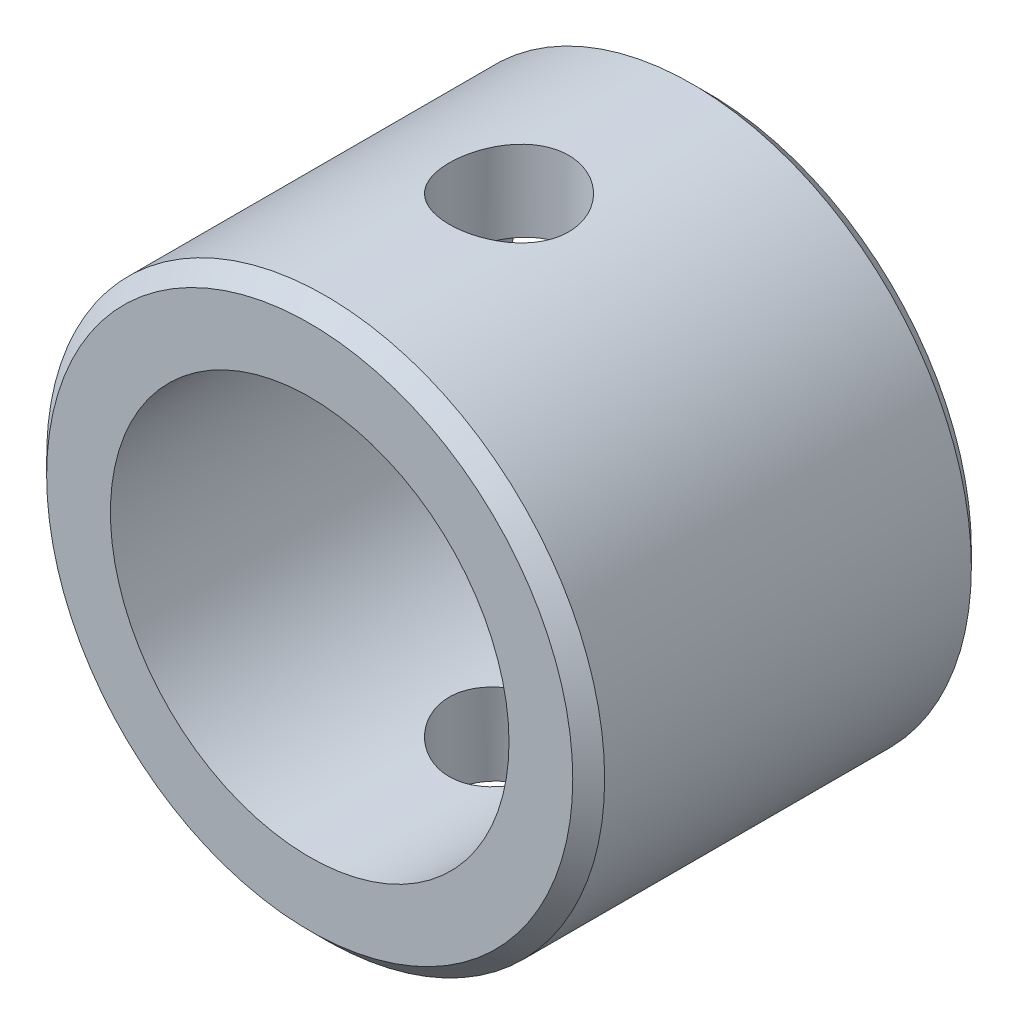
ISO-10303-21;
HEADER;
FILE_DESCRIPTION(('STEP AP214'),'2;1');
FILE_NAME('part.step','',(''),(''),'','','');
FILE_SCHEMA(('AUTOMOTIVE_DESIGN { 1 0 10303 214 1 1 1 1 }'));
ENDSEC;
DATA;
#1=APPLICATION_CONTEXT('core data for automotive mechanical design processes');
#2=APPLICATION_PROTOCOL_DEFINITION('international standard','automotive_design',2000,#1);
#3=PRODUCT_CONTEXT('',#1,'mechanical');
#4=PRODUCT('Part','Part','',(#3));
#5=PRODUCT_RELATED_PRODUCT_CATEGORY('part','',(#4));
#6=PRODUCT_DEFINITION_FORMATION('','',#4);
#7=PRODUCT_DEFINITION_CONTEXT('part definition',#1,'design');
#8=PRODUCT_DEFINITION('design','',#6,#7);
#9=PRODUCT_DEFINITION_SHAPE('','',#8);
#10=(LENGTH_UNIT() NAMED_UNIT(*) SI_UNIT(.MILLI.,.METRE.));
#11=(NAMED_UNIT(*) PLANE_ANGLE_UNIT() SI_UNIT($,.RADIAN.));
#12=(NAMED_UNIT(*) SI_UNIT($,.STERADIAN.) SOLID_ANGLE_UNIT());
#13=UNCERTAINTY_MEASURE_WITH_UNIT(LENGTH_MEASURE(1.E-05),#10,'distance_accuracy_value','');
#14=(GEOMETRIC_REPRESENTATION_CONTEXT(3) GLOBAL_UNCERTAINTY_ASSIGNED_CONTEXT((#13)) GLOBAL_UNIT_ASSIGNED_CONTEXT((#10,
#11,#12)) REPRESENTATION_CONTEXT('',''));
#15=CARTESIAN_POINT('',(0.,0.,0.));
#16=DIRECTION('',(0.,0.,1.));
#17=DIRECTION('',(1.,0.,0.));
#18=AXIS2_PLACEMENT_3D('',#15,#16,#17);
#19=CARTESIAN_POINT('',(0.,0.,2.5));
#20=DIRECTION('',(0.,0.,1.));
#21=DIRECTION('',(1.,0.,0.));
#22=AXIS2_PLACEMENT_3D('',#19,#20,#21);
#23=PLANE('',#22);
#24=CARTESIAN_POINT('',(0.,0.,2.5));
#25=DIRECTION('',(0.,0.,1.));
#26=DIRECTION('',(1.,0.,0.));
#27=AXIS2_PLACEMENT_3D('',#24,#25,#26);
#28=CIRCLE('',#27,3.3);
#29=CARTESIAN_POINT('',(3.3,0.,2.5));
#30=VERTEX_POINT('',#29);
#31=EDGE_CURVE('E10',#30,#30,#28,.T.);
#32=ORIENTED_EDGE('',*,*,#31,.T.);
#33=EDGE_LOOP('',(#32));
#34=FACE_BOUND('',#33,.T.);
#35=CARTESIAN_POINT('',(0.,0.,2.5));
#36=DIRECTION('',(0.,0.,1.));
#37=DIRECTION('',(1.,0.,0.));
#38=AXIS2_PLACEMENT_3D('',#35,#36,#37);
#39=CIRCLE('',#38,2.5);
#40=CARTESIAN_POINT('',(2.5,0.,2.5));
#41=VERTEX_POINT('',#40);
#42=EDGE_CURVE('E85',#41,#41,#39,.T.);
#43=ORIENTED_EDGE('',*,*,#42,.F.);
#44=EDGE_LOOP('',(#43));
#45=FACE_BOUND('',#44,.T.);
#46=ADVANCED_FACE('F32',(#34,#45),#23,.T.);
#47=CARTESIAN_POINT('',(0.,0.,-2.5));
#48=DIRECTION('',(0.,0.,1.));
#49=DIRECTION('',(1.,0.,0.));
#50=AXIS2_PLACEMENT_3D('',#47,#48,#49);
#51=PLANE('',#50);
#52=CARTESIAN_POINT('',(0.,0.,-2.5));
#53=DIRECTION('',(0.,0.,1.));
#54=DIRECTION('',(1.,0.,0.));
#55=AXIS2_PLACEMENT_3D('',#52,#53,#54);
#56=CIRCLE('',#55,3.3);
#57=CARTESIAN_POINT('',(3.3,0.,-2.5));
#58=VERTEX_POINT('',#57);
#59=EDGE_CURVE('E45',#58,#58,#56,.F.);
#60=ORIENTED_EDGE('',*,*,#59,.T.);
#61=EDGE_LOOP('',(#60));
#62=FACE_BOUND('',#61,.T.);
#63=CARTESIAN_POINT('',(0.,0.,-2.5));
#64=DIRECTION('',(0.,0.,1.));
#65=DIRECTION('',(1.,0.,0.));
#66=AXIS2_PLACEMENT_3D('',#63,#64,#65);
#67=CIRCLE('',#66,2.5);
#68=CARTESIAN_POINT('',(2.5,0.,-2.5));
#69=VERTEX_POINT('',#68);
#70=EDGE_CURVE('E82',#69,#69,#67,.T.);
#71=ORIENTED_EDGE('',*,*,#70,.T.);
#72=EDGE_LOOP('',(#71));
#73=FACE_BOUND('',#72,.T.);
#74=ADVANCED_FACE('F106',(#62,#73),#51,.F.);
#75=CARTESIAN_POINT('',(0.,0.,2.5));
#76=DIRECTION('',(0.,0.,-1.));
#77=DIRECTION('',(-1.,0.,0.));
#78=AXIS2_PLACEMENT_3D('',#75,#76,#77);
#79=CYLINDRICAL_SURFACE('',#78,3.5);
#80=CARTESIAN_POINT('',(0.,-3.5,0.75));
#81=CARTESIAN_POINT('',(0.0416179430453083,-3.49999923021613,0.749998550212849));
#82=CARTESIAN_POINT('',(0.0832535978001373,-3.49925012974855,0.746524195806072));
#83=CARTESIAN_POINT('',(0.165343672146664,-3.49633414913864,0.732732171573204));
#84=CARTESIAN_POINT('',(0.205797201785595,-3.4941662281855,0.722409477902533));
#85=CARTESIAN_POINT('',(0.284324661908868,-3.48865415894413,0.695257817695982));
#86=CARTESIAN_POINT('',(0.322400981723278,-3.48531121483585,0.678435510309341));
#87=CARTESIAN_POINT('',(0.395189088980394,-3.47781053408985,0.638782956914368));
#88=CARTESIAN_POINT('',(0.429900990873685,-3.4736528251833,0.615952915375029));
#89=CARTESIAN_POINT('',(0.495512395267615,-3.46490684623155,0.564559850163246));
#90=CARTESIAN_POINT('',(0.526352517097226,-3.4603134157163,0.535921889050737));
#91=CARTESIAN_POINT('',(0.582830211947175,-3.45125034907072,0.473886842157402));
#92=CARTESIAN_POINT('',(0.608467335754541,-3.44678072365815,0.440489345874371));
#93=CARTESIAN_POINT('',(0.654071021899043,-3.43842058023612,0.369447123569784));
#94=CARTESIAN_POINT('',(0.673974791675044,-3.4345366817218,0.331761241121895));
#95=CARTESIAN_POINT('',(0.707144118455738,-3.42786162779268,0.253482773116581));
#96=CARTESIAN_POINT('',(0.720410435008579,-3.42507034735355,0.212890520753713));
#97=CARTESIAN_POINT('',(0.739732872112272,-3.42094904463155,0.130594456705963));
#98=CARTESIAN_POINT('',(0.745893898741712,-3.41959778448243,0.0889163621680674));
#99=CARTESIAN_POINT('',(0.751156976032885,-3.41844569922553,0.00509788374650247));
#100=CARTESIAN_POINT('',(0.750259858323147,-3.41864469145864,-0.0370424450899735));
#101=CARTESIAN_POINT('',(0.741516631704307,-3.42055138301916,-0.119812343966896));
#102=CARTESIAN_POINT('',(0.733791993247041,-3.42223270841081,-0.160455444550077));
#103=CARTESIAN_POINT('',(0.711805271493384,-3.42687296687894,-0.239855120144671));
#104=CARTESIAN_POINT('',(0.697542834682328,-3.42983196904201,-0.27861159301616));
#105=CARTESIAN_POINT('',(0.662772755379956,-3.43672040377862,-0.353481436436669));
#106=CARTESIAN_POINT('',(0.642218054864149,-3.44065710491682,-0.389572256356276));
#107=CARTESIAN_POINT('',(0.595480036419966,-3.44905286250644,-0.457837582478979));
#108=CARTESIAN_POINT('',(0.56929598051781,-3.45351198740948,-0.490011574343101));
#109=CARTESIAN_POINT('',(0.511397713776601,-3.46256359196939,-0.550229677836699));
#110=CARTESIAN_POINT('',(0.479580116982205,-3.46715691986089,-0.578174353292369));
#111=CARTESIAN_POINT('',(0.411658653134548,-3.4758750874853,-0.62834686684483));
#112=CARTESIAN_POINT('',(0.3755547143877,-3.47999991937986,-0.650574609300195));
#113=CARTESIAN_POINT('',(0.29996673102498,-3.48732889267001,-0.688705339953465));
#114=CARTESIAN_POINT('',(0.260476129431741,-3.49053119321677,-0.704595706288991));
#115=CARTESIAN_POINT('',(0.179301573342853,-3.49564054622667,-0.729487824160543));
#116=CARTESIAN_POINT('',(0.137617925566835,-3.49754777930192,-0.738490536281658));
#117=CARTESIAN_POINT('',(0.0540938354183148,-3.49982653173904,-0.749208107071712));
#118=CARTESIAN_POINT('',(0.0122715886358077,-3.50022668260533,-0.75105885644089));
#119=CARTESIAN_POINT('',(-0.071084486825202,-3.49952624467985,-0.747787714437418));
#120=CARTESIAN_POINT('',(-0.112618334063627,-3.49842575337849,-0.74266627601853));
#121=CARTESIAN_POINT('',(-0.193771268991403,-3.49486571522633,-0.725708878169149));
#122=CARTESIAN_POINT('',(-0.233405856454239,-3.4924205252273,-0.713943815263733));
#123=CARTESIAN_POINT('',(-0.310139225236709,-3.48644462210755,-0.68411152850259));
#124=CARTESIAN_POINT('',(-0.34723779629387,-3.48291381911119,-0.666043782844173));
#125=CARTESIAN_POINT('',(-0.418410698982377,-3.475087521952,-0.623833228469837));
#126=CARTESIAN_POINT('',(-0.45243628755557,-3.47078215677137,-0.599610102545136));
#127=CARTESIAN_POINT('',(-0.515988462761798,-3.46190516517423,-0.545882587555632));
#128=CARTESIAN_POINT('',(-0.545514489345998,-3.45733350571049,-0.516377542056279));
#129=CARTESIAN_POINT('',(-0.599763555289945,-3.44834086353162,-0.452301314906432));
#130=CARTESIAN_POINT('',(-0.624392686275782,-3.44392396110642,-0.417649950388949));
#131=CARTESIAN_POINT('',(-0.667482076930202,-3.4358332727984,-0.344622701761004));
#132=CARTESIAN_POINT('',(-0.685942599568528,-3.43215945524027,-0.306246976511254));
#133=CARTESIAN_POINT('',(-0.716048706242739,-3.42600504903695,-0.227063850502699));
#134=CARTESIAN_POINT('',(-0.727731993206375,-3.42351787291483,-0.186271321784666));
#135=CARTESIAN_POINT('',(-0.744063480426676,-3.42000593354209,-0.103242208083182));
#136=CARTESIAN_POINT('',(-0.748712753901288,-3.41898094719853,-0.0610058443993403));
#137=CARTESIAN_POINT('',(-0.750799999630202,-3.41852309424078,0.0227661715876213));
#138=CARTESIAN_POINT('',(-0.748386736291556,-3.41905738259271,0.0642980074902891));
#139=CARTESIAN_POINT('',(-0.736748947031653,-3.42158381592415,0.146348621066293));
#140=CARTESIAN_POINT('',(-0.727524494789895,-3.42357594513357,0.186867409693287));
#141=CARTESIAN_POINT('',(-0.702596729702168,-3.42877790552079,0.265629328934584));
#142=CARTESIAN_POINT('',(-0.686914235854434,-3.43198382112351,0.303879324332146));
#143=CARTESIAN_POINT('',(-0.649533757978003,-3.43925382295324,0.377227686253425));
#144=CARTESIAN_POINT('',(-0.627835176507498,-3.44331799440181,0.412325739307522));
#145=CARTESIAN_POINT('',(-0.578541451746518,-3.45194527796616,0.479109096862683));
#146=CARTESIAN_POINT('',(-0.550839937106183,-3.45651654969463,0.510714847973489));
#147=CARTESIAN_POINT('',(-0.49054327730981,-3.46558724899847,0.56887813126023));
#148=CARTESIAN_POINT('',(-0.457947004692798,-3.47008665975648,0.595434497156103));
#149=CARTESIAN_POINT('',(-0.388301573634359,-3.47857245524493,0.643057979752781));
#150=CARTESIAN_POINT('',(-0.351202423004821,-3.48255182285313,0.664053303115489));
#151=CARTESIAN_POINT('',(-0.273925080470299,-3.48947913052009,0.699477264453091));
#152=CARTESIAN_POINT('',(-0.23374955293194,-3.49242795106171,0.713911511292518));
#153=CARTESIAN_POINT('',(-0.161267608776602,-3.49642424230886,0.733176092565575));
#154=CARTESIAN_POINT('',(-0.129358602772989,-3.49775695944132,0.739473216990016));
#155=CARTESIAN_POINT('',(-0.0649699804269229,-3.4995451207736,0.747885650855834));
#156=CARTESIAN_POINT('',(-0.0324903875443724,-3.50000060095657,0.75000113182303));
#157=CARTESIAN_POINT('',(0.,-3.5,0.75));
#158=B_SPLINE_CURVE_WITH_KNOTS('',3,(#80,#81,#82,#83,#84,#85,#86,#87,#88,#89,#90,#91,#92,#93,
#94,#95,#96,#97,#98,#99,#100,#101,#102,#103,#104,#105,#106,#107,#108,#109,#110,#111,#112,#113,
#114,#115,#116,#117,#118,#119,#120,#121,#122,#123,#124,#125,#126,#127,#128,#129,#130,#131,#132,
#133,#134,#135,#136,#137,#138,#139,#140,#141,#142,#143,#144,#145,#146,#147,#148,#149,#150,#151,
#152,#153,#154,#155,#156,#157),.UNSPECIFIED.,.T.,.F.,(4,2,2,2,2,2,2,2,2,2,2,2,2,2,2,2,2,2,2,2,2,
2,2,2,2,2,2,2,2,2,2,2,2,2,2,2,2,2,4),(0.,0.124734918256041,0.249561441609968,0.374260412212801,
0.498955139322943,0.62537480940866,0.751805389592532,0.879572146072552,1.00732427838745,
1.13316504062333,1.25899097584582,1.38262237726464,1.50626046452284,1.63084678082984,
1.75544943960445,1.88263505525145,2.00982279851175,2.13726260569903,2.26468463628172,
2.38967332852092,2.51465390115715,2.63832530294634,2.76200694599217,2.88739366933901,
3.01279598652242,3.14041031641767,3.26801920537903,3.39491120204237,3.52178383614593,
3.64600340270147,3.77022162554135,3.89404249853393,4.01787567225812,4.14411475077057,
4.27038295198557,4.39820955178611,4.52592667005135,4.62330899566147,4.72068732668668),.UNSPECIFIED.);
#159=CARTESIAN_POINT('',(0.,-3.5,0.75));
#160=VERTEX_POINT('',#159);
#161=EDGE_CURVE('E77',#160,#160,#158,.T.);
#162=ORIENTED_EDGE('',*,*,#161,.T.);
#163=EDGE_LOOP('',(#162));
#164=FACE_BOUND('',#163,.T.);
#165=CARTESIAN_POINT('',(0.,3.5,0.75));
#166=CARTESIAN_POINT('',(-0.0416179430453083,3.49999923021613,0.749998550212849));
#167=CARTESIAN_POINT('',(-0.0832535978001373,3.49925012974855,0.746524195806072));
#168=CARTESIAN_POINT('',(-0.165343672146664,3.49633414913864,0.732732171573204));
#169=CARTESIAN_POINT('',(-0.205797201785595,3.4941662281855,0.722409477902533));
#170=CARTESIAN_POINT('',(-0.284324661908868,3.48865415894413,0.695257817695982));
#171=CARTESIAN_POINT('',(-0.322400981723278,3.48531121483585,0.678435510309341));
#172=CARTESIAN_POINT('',(-0.395189088980394,3.47781053408985,0.638782956914368));
#173=CARTESIAN_POINT('',(-0.429900990873685,3.4736528251833,0.615952915375029));
#174=CARTESIAN_POINT('',(-0.495512395267615,3.46490684623155,0.564559850163246));
#175=CARTESIAN_POINT('',(-0.526352517097226,3.4603134157163,0.535921889050737));
#176=CARTESIAN_POINT('',(-0.582830211947175,3.45125034907072,0.473886842157402));
#177=CARTESIAN_POINT('',(-0.608467335754541,3.44678072365815,0.440489345874371));
#178=CARTESIAN_POINT('',(-0.654071021899043,3.43842058023612,0.369447123569784));
#179=CARTESIAN_POINT('',(-0.673974791675044,3.4345366817218,0.331761241121895));
#180=CARTESIAN_POINT('',(-0.707144118455738,3.42786162779268,0.253482773116581));
#181=CARTESIAN_POINT('',(-0.720410435008579,3.42507034735355,0.212890520753713));
#182=CARTESIAN_POINT('',(-0.739732872112272,3.42094904463155,0.130594456705963));
#183=CARTESIAN_POINT('',(-0.745893898741712,3.41959778448243,0.0889163621680674));
#184=CARTESIAN_POINT('',(-0.751156976032885,3.41844569922553,0.00509788374650247));
#185=CARTESIAN_POINT('',(-0.750259858323147,3.41864469145864,-0.0370424450899735));
#186=CARTESIAN_POINT('',(-0.741516631704307,3.42055138301916,-0.119812343966896));
#187=CARTESIAN_POINT('',(-0.733791993247041,3.42223270841081,-0.160455444550077));
#188=CARTESIAN_POINT('',(-0.711805271493384,3.42687296687894,-0.239855120144671));
#189=CARTESIAN_POINT('',(-0.697542834682328,3.42983196904201,-0.27861159301616));
#190=CARTESIAN_POINT('',(-0.662772755379956,3.43672040377862,-0.353481436436669));
#191=CARTESIAN_POINT('',(-0.642218054864149,3.44065710491682,-0.389572256356276));
#192=CARTESIAN_POINT('',(-0.595480036419966,3.44905286250644,-0.457837582478979));
#193=CARTESIAN_POINT('',(-0.56929598051781,3.45351198740948,-0.490011574343101));
#194=CARTESIAN_POINT('',(-0.511397713776601,3.46256359196939,-0.550229677836699));
#195=CARTESIAN_POINT('',(-0.479580116982205,3.46715691986089,-0.578174353292369));
#196=CARTESIAN_POINT('',(-0.411658653134548,3.4758750874853,-0.62834686684483));
#197=CARTESIAN_POINT('',(-0.3755547143877,3.47999991937986,-0.650574609300195));
#198=CARTESIAN_POINT('',(-0.29996673102498,3.48732889267001,-0.688705339953465));
#199=CARTESIAN_POINT('',(-0.260476129431741,3.49053119321677,-0.704595706288991));
#200=CARTESIAN_POINT('',(-0.179301573342853,3.49564054622667,-0.729487824160543));
#201=CARTESIAN_POINT('',(-0.137617925566835,3.49754777930192,-0.738490536281658));
#202=CARTESIAN_POINT('',(-0.0540938354183148,3.49982653173904,-0.749208107071712));
#203=CARTESIAN_POINT('',(-0.0122715886358077,3.50022668260533,-0.75105885644089));
#204=CARTESIAN_POINT('',(0.071084486825202,3.49952624467985,-0.747787714437418));
#205=CARTESIAN_POINT('',(0.112618334063627,3.49842575337849,-0.74266627601853));
#206=CARTESIAN_POINT('',(0.193771268991403,3.49486571522633,-0.725708878169149));
#207=CARTESIAN_POINT('',(0.233405856454239,3.4924205252273,-0.713943815263733));
#208=CARTESIAN_POINT('',(0.310139225236709,3.48644462210755,-0.68411152850259));
#209=CARTESIAN_POINT('',(0.34723779629387,3.48291381911119,-0.666043782844173));
#210=CARTESIAN_POINT('',(0.418410698982377,3.475087521952,-0.623833228469837));
#211=CARTESIAN_POINT('',(0.45243628755557,3.47078215677137,-0.599610102545136));
#212=CARTESIAN_POINT('',(0.515988462761798,3.46190516517423,-0.545882587555632));
#213=CARTESIAN_POINT('',(0.545514489345998,3.45733350571049,-0.516377542056279));
#214=CARTESIAN_POINT('',(0.599763555289945,3.44834086353162,-0.452301314906432));
#215=CARTESIAN_POINT('',(0.624392686275782,3.44392396110642,-0.417649950388949));
#216=CARTESIAN_POINT('',(0.667482076930202,3.4358332727984,-0.344622701761004));
#217=CARTESIAN_POINT('',(0.685942599568528,3.43215945524027,-0.306246976511254));
#218=CARTESIAN_POINT('',(0.716048706242739,3.42600504903695,-0.227063850502699));
#219=CARTESIAN_POINT('',(0.727731993206375,3.42351787291483,-0.186271321784666));
#220=CARTESIAN_POINT('',(0.744063480426676,3.42000593354209,-0.103242208083182));
#221=CARTESIAN_POINT('',(0.748712753901288,3.41898094719853,-0.0610058443993403));
#222=CARTESIAN_POINT('',(0.750799999630202,3.41852309424078,0.0227661715876213));
#223=CARTESIAN_POINT('',(0.748386736291556,3.41905738259271,0.0642980074902891));
#224=CARTESIAN_POINT('',(0.736748947031653,3.42158381592415,0.146348621066293));
#225=CARTESIAN_POINT('',(0.727524494789895,3.42357594513357,0.186867409693287));
#226=CARTESIAN_POINT('',(0.702596729702168,3.42877790552079,0.265629328934584));
#227=CARTESIAN_POINT('',(0.686914235854434,3.43198382112351,0.303879324332146));
#228=CARTESIAN_POINT('',(0.649533757978003,3.43925382295324,0.377227686253425));
#229=CARTESIAN_POINT('',(0.627835176507498,3.44331799440181,0.412325739307522));
#230=CARTESIAN_POINT('',(0.578541451746518,3.45194527796616,0.479109096862683));
#231=CARTESIAN_POINT('',(0.550839937106183,3.45651654969463,0.510714847973489));
#232=CARTESIAN_POINT('',(0.49054327730981,3.46558724899847,0.56887813126023));
#233=CARTESIAN_POINT('',(0.457947004692798,3.47008665975648,0.595434497156103));
#234=CARTESIAN_POINT('',(0.388301573634359,3.47857245524493,0.643057979752781));
#235=CARTESIAN_POINT('',(0.351202423004821,3.48255182285313,0.664053303115489));
#236=CARTESIAN_POINT('',(0.273925080470299,3.48947913052009,0.699477264453091));
#237=CARTESIAN_POINT('',(0.23374955293194,3.49242795106171,0.713911511292518));
#238=CARTESIAN_POINT('',(0.161267608776602,3.49642424230886,0.733176092565575));
#239=CARTESIAN_POINT('',(0.129358602772989,3.49775695944132,0.739473216990016));
#240=CARTESIAN_POINT('',(0.0649699804269229,3.4995451207736,0.747885650855834));
#241=CARTESIAN_POINT('',(0.0324903875443724,3.50000060095657,0.75000113182303));
#242=CARTESIAN_POINT('',(0.,3.5,0.75));
#243=B_SPLINE_CURVE_WITH_KNOTS('',3,(#165,#166,#167,#168,#169,#170,#171,#172,#173,#174,#175,
#176,#177,#178,#179,#180,#181,#182,#183,#184,#185,#186,#187,#188,#189,#190,#191,#192,#193,#194,
#195,#196,#197,#198,#199,#200,#201,#202,#203,#204,#205,#206,#207,#208,#209,#210,#211,#212,#213,
#214,#215,#216,#217,#218,#219,#220,#221,#222,#223,#224,#225,#226,#227,#228,#229,#230,#231,#232,
#233,#234,#235,#236,#237,#238,#239,#240,#241,#242),.UNSPECIFIED.,.T.,.F.,(4,2,2,2,2,2,2,2,2,2,2,
2,2,2,2,2,2,2,2,2,2,2,2,2,2,2,2,2,2,2,2,2,2,2,2,2,2,2,4),(0.,0.124734918256041,
0.249561441609968,0.374260412212801,0.498955139322943,0.62537480940866,0.751805389592532,
0.879572146072552,1.00732427838745,1.13316504062333,1.25899097584582,1.38262237726464,
1.50626046452284,1.63084678082984,1.75544943960445,1.88263505525145,2.00982279851175,
2.13726260569903,2.26468463628172,2.38967332852092,2.51465390115715,2.63832530294634,
2.76200694599217,2.88739366933901,3.01279598652242,3.14041031641767,3.26801920537903,
3.39491120204237,3.52178383614593,3.64600340270147,3.77022162554135,3.89404249853393,
4.01787567225812,4.14411475077057,4.27038295198557,4.39820955178611,4.52592667005135,
4.62330899566147,4.72068732668668),.UNSPECIFIED.);
#244=CARTESIAN_POINT('',(0.,3.5,0.75));
#245=VERTEX_POINT('',#244);
#246=EDGE_CURVE('E73',#245,#245,#243,.T.);
#247=ORIENTED_EDGE('',*,*,#246,.T.);
#248=EDGE_LOOP('',(#247));
#249=FACE_BOUND('',#248,.T.);
#250=CARTESIAN_POINT('',(0.,0.,-2.3));
#251=DIRECTION('',(0.,0.,1.));
#252=DIRECTION('',(1.,0.,0.));
#253=AXIS2_PLACEMENT_3D('',#250,#251,#252);
#254=CIRCLE('',#253,3.5);
#255=CARTESIAN_POINT('',(3.5,0.,-2.3));
#256=VERTEX_POINT('',#255);
#257=EDGE_CURVE('E50',#256,#256,#254,.T.);
#258=ORIENTED_EDGE('',*,*,#257,.T.);
#259=EDGE_LOOP('',(#258));
#260=FACE_BOUND('',#259,.T.);
#261=CARTESIAN_POINT('',(0.,0.,2.3));
#262=DIRECTION('',(0.,0.,1.));
#263=DIRECTION('',(1.,0.,0.));
#264=AXIS2_PLACEMENT_3D('',#261,#262,#263);
#265=CIRCLE('',#264,3.5);
#266=CARTESIAN_POINT('',(3.5,0.,2.3));
#267=VERTEX_POINT('',#266);
#268=EDGE_CURVE('E88',#267,#267,#265,.F.);
#269=ORIENTED_EDGE('',*,*,#268,.T.);
#270=EDGE_LOOP('',(#269));
#271=FACE_BOUND('',#270,.T.);
#272=ADVANCED_FACE('F34',(#164,#249,#260,#271),#79,.T.);
#273=CARTESIAN_POINT('',(0.,0.,2.5));
#274=DIRECTION('',(0.,0.,-1.));
#275=DIRECTION('',(-1.,0.,0.));
#276=AXIS2_PLACEMENT_3D('',#273,#274,#275);
#277=CYLINDRICAL_SURFACE('',#276,2.5);
#278=CARTESIAN_POINT('',(0.,-2.5,0.75));
#279=CARTESIAN_POINT('',(0.04114430637665,-2.49999964625275,0.749999501257557));
#280=CARTESIAN_POINT('',(0.0822936591757648,-2.49897457846979,0.746603068188016));
#281=CARTESIAN_POINT('',(0.16339406265244,-2.49498552796844,0.73313932288895));
#282=CARTESIAN_POINT('',(0.20334475220571,-2.49202096694839,0.723070020988332));
#283=CARTESIAN_POINT('',(0.280866353877264,-2.48447776250925,0.696626991544865));
#284=CARTESIAN_POINT('',(0.318440682197688,-2.47990150125239,0.680262565190522));
#285=CARTESIAN_POINT('',(0.390312090526564,-2.46961054618796,0.641731953472092));
#286=CARTESIAN_POINT('',(0.42460873373483,-2.46389570095935,0.619564996302328));
#287=CARTESIAN_POINT('',(0.489935898591878,-2.45175368596488,0.569387996263628));
#288=CARTESIAN_POINT('',(0.52085903562219,-2.445311918289,0.541241687056902));
#289=CARTESIAN_POINT('',(0.577624604616599,-2.43252917104839,0.480195385045049));
#290=CARTESIAN_POINT('',(0.603466181637131,-2.42618820860824,0.447294593938046));
#291=CARTESIAN_POINT('',(0.649900188618613,-2.41417056998345,0.376764623480656));
#292=CARTESIAN_POINT('',(0.67036154511135,-2.4085120333744,0.339045769502603));
#293=CARTESIAN_POINT('',(0.704606973873519,-2.39871810191514,0.260505372886881));
#294=CARTESIAN_POINT('',(0.71839264959881,-2.39458234136111,0.219684578043583));
#295=CARTESIAN_POINT('',(0.738508168412816,-2.38845435439231,0.13730486693343));
#296=CARTESIAN_POINT('',(0.745035981175235,-2.38640534735888,0.0957986280532265));
#297=CARTESIAN_POINT('',(0.751068653075396,-2.38451394948142,0.0122334218736274));
#298=CARTESIAN_POINT('',(0.750575213805359,-2.38467102399598,-0.0298254090372626));
#299=CARTESIAN_POINT('',(0.742734885998503,-2.38712372015292,-0.111691954302934));
#300=CARTESIAN_POINT('',(0.735636026313277,-2.38934194294585,-0.151526125180769));
#301=CARTESIAN_POINT('',(0.715187102135428,-2.39554178119298,-0.229409893137081));
#302=CARTESIAN_POINT('',(0.701836420708244,-2.3995235706752,-0.267459313687261));
#303=CARTESIAN_POINT('',(0.669080133268367,-2.40886366536123,-0.341300174830274));
#304=CARTESIAN_POINT('',(0.649594084673201,-2.4142400805761,-0.377053541977606));
#305=CARTESIAN_POINT('',(0.605176112943427,-2.42575493500398,-0.444866011005122));
#306=CARTESIAN_POINT('',(0.580242870012944,-2.43189355873595,-0.476924214706896));
#307=CARTESIAN_POINT('',(0.524406453827728,-2.44455505648865,-0.537843095381003));
#308=CARTESIAN_POINT('',(0.493297453733485,-2.45108327155221,-0.566514332014834));
#309=CARTESIAN_POINT('',(0.426631629656984,-2.46356122031657,-0.618276992032127));
#310=CARTESIAN_POINT('',(0.391074525930444,-2.46951091759212,-0.641368064207214));
#311=CARTESIAN_POINT('',(0.316177519171401,-2.48021580034728,-0.681429961232365));
#312=CARTESIAN_POINT('',(0.276813874873975,-2.48496271834155,-0.698358758124931));
#313=CARTESIAN_POINT('',(0.195622707801759,-2.49266760916113,-0.725299795049816));
#314=CARTESIAN_POINT('',(0.153795875794791,-2.495626080935,-0.735313964266245));
#315=CARTESIAN_POINT('',(0.0704761213341654,-2.49934182321769,-0.747826088949697));
#316=CARTESIAN_POINT('',(0.0290250488005928,-2.50017425208896,-0.750580792900804));
#317=CARTESIAN_POINT('',(-0.0537498029116913,-2.49976461620878,-0.749215422143961));
#318=CARTESIAN_POINT('',(-0.0950735983453891,-2.49852282838873,-0.745096265174283));
#319=CARTESIAN_POINT('',(-0.17545180265485,-2.49415348493587,-0.730307694444248));
#320=CARTESIAN_POINT('',(-0.21453638630709,-2.49106914899727,-0.719788306209551));
#321=CARTESIAN_POINT('',(-0.290377319477256,-2.48337173920747,-0.692678383610914));
#322=CARTESIAN_POINT('',(-0.327133388512772,-2.47875848160472,-0.676087119481123));
#323=CARTESIAN_POINT('',(-0.398218594730547,-2.46834827175735,-0.636873417259379));
#324=CARTESIAN_POINT('',(-0.432471913099914,-2.4625264041511,-0.614120329525805));
#325=CARTESIAN_POINT('',(-0.496761653989995,-2.45036734381886,-0.563387622973804));
#326=CARTESIAN_POINT('',(-0.526797016177672,-2.44403002214522,-0.535406694056946));
#327=CARTESIAN_POINT('',(-0.582928722755441,-2.43126585935624,-0.473806345814516));
#328=CARTESIAN_POINT('',(-0.608842406158679,-2.42484412520639,-0.440019062111055));
#329=CARTESIAN_POINT('',(-0.654644975359607,-2.41288257615227,-0.36843603049631));
#330=CARTESIAN_POINT('',(-0.674534019143021,-2.40734273812361,-0.330640387732386));
#331=CARTESIAN_POINT('',(-0.707586735638617,-2.39783594822466,-0.252233754364879));
#332=CARTESIAN_POINT('',(-0.720781734698862,-2.39386168977456,-0.211636906696705));
#333=CARTESIAN_POINT('',(-0.740108654089556,-2.38795797236724,-0.128656015497233));
#334=CARTESIAN_POINT('',(-0.746242994897492,-2.38602781268684,-0.0862725895943309));
#335=CARTESIAN_POINT('',(-0.751109922422095,-2.38449986234108,-0.00281924081899464));
#336=CARTESIAN_POINT('',(-0.750140276541593,-2.38480823717645,0.0382318255068891));
#337=CARTESIAN_POINT('',(-0.741537527224924,-2.38749700647879,0.119557051688304));
#338=CARTESIAN_POINT('',(-0.733904690623809,-2.3898773179727,0.159831242588684));
#339=CARTESIAN_POINT('',(-0.712384444020455,-2.39637881834211,0.237972699570925));
#340=CARTESIAN_POINT('',(-0.698575877535282,-2.40047802272719,0.275863643680712));
#341=CARTESIAN_POINT('',(-0.665157535605706,-2.40995139454832,0.348821219408996));
#342=CARTESIAN_POINT('',(-0.645546649814398,-2.41532580597228,0.383887308820415));
#343=CARTESIAN_POINT('',(-0.600243819025343,-2.42698838212842,0.451581558263519));
#344=CARTESIAN_POINT('',(-0.574356380464964,-2.43330270081879,0.484074380630196));
#345=CARTESIAN_POINT('',(-0.517587173148914,-2.44600660225033,0.544351249153942));
#346=CARTESIAN_POINT('',(-0.486704108567251,-2.45239620411958,0.572134069733882));
#347=CARTESIAN_POINT('',(-0.419732881091622,-2.46475468285319,0.623011706147513));
#348=CARTESIAN_POINT('',(-0.383518942895303,-2.47070579882836,0.645945723427744));
#349=CARTESIAN_POINT('',(-0.307570686991765,-2.48130340227908,0.685367584952013));
#350=CARTESIAN_POINT('',(-0.267838026499477,-2.48595049965534,0.701858444137255));
#351=CARTESIAN_POINT('',(-0.19037885632764,-2.4930108748465,0.726447637826375));
#352=CARTESIAN_POINT('',(-0.152893480977117,-2.49561013690534,0.735255836441624));
#353=CARTESIAN_POINT('',(-0.0769400976153899,-2.49910472247246,0.747031762620789));
#354=CARTESIAN_POINT('',(-0.0384722549290699,-2.5000003307737,0.75000046635241));
#355=CARTESIAN_POINT('',(0.,-2.5,0.75));
#356=B_SPLINE_CURVE_WITH_KNOTS('',3,(#278,#279,#280,#281,#282,#283,#284,#285,#286,#287,#288,
#289,#290,#291,#292,#293,#294,#295,#296,#297,#298,#299,#300,#301,#302,#303,#304,#305,#306,#307,
#308,#309,#310,#311,#312,#313,#314,#315,#316,#317,#318,#319,#320,#321,#322,#323,#324,#325,#326,
#327,#328,#329,#330,#331,#332,#333,#334,#335,#336,#337,#338,#339,#340,#341,#342,#343,#344,#345,
#346,#347,#348,#349,#350,#351,#352,#353,#354,#355),.UNSPECIFIED.,.T.,.F.,(4,2,2,2,2,2,2,2,2,2,2,
2,2,2,2,2,2,2,2,2,2,2,2,2,2,2,2,2,2,2,2,2,2,2,2,2,2,2,4),(0.,0.123291601806305,0.246619982423,
0.369766838150437,0.492930082206351,0.619278014740957,0.745647186443165,0.874857405020545,
1.00403657271612,1.12959844676438,1.25512989155768,1.37613008345061,1.49714221825224,
1.61981213219783,1.74251180075501,1.87033552020306,1.99816728261759,2.12685523437067,
2.25550726760627,2.37954404715496,2.50356426771387,2.62478373337387,2.74601777293087,
2.87005652847677,2.99412640996319,3.12270200157632,3.25127422122563,3.37923907470651,
3.50716004723841,3.62975077727171,3.75233659824499,3.8734002019506,3.99448698770253,
4.11998462833665,4.2455148744245,4.37471498072035,4.50385455791317,4.61915845958929,
4.73444308468136),.UNSPECIFIED.);
#357=CARTESIAN_POINT('',(0.,-2.5,0.75));
#358=VERTEX_POINT('',#357);
#359=EDGE_CURVE('E37',#358,#358,#356,.T.);
#360=ORIENTED_EDGE('',*,*,#359,.F.);
#361=EDGE_LOOP('',(#360));
#362=FACE_BOUND('',#361,.T.);
#363=CARTESIAN_POINT('',(0.,2.5,0.75));
#364=CARTESIAN_POINT('',(-0.04114430637665,2.49999964625275,0.749999501257557));
#365=CARTESIAN_POINT('',(-0.0822936591757648,2.49897457846979,0.746603068188016));
#366=CARTESIAN_POINT('',(-0.16339406265244,2.49498552796844,0.73313932288895));
#367=CARTESIAN_POINT('',(-0.20334475220571,2.49202096694839,0.723070020988332));
#368=CARTESIAN_POINT('',(-0.280866353877264,2.48447776250925,0.696626991544865));
#369=CARTESIAN_POINT('',(-0.318440682197688,2.47990150125239,0.680262565190522));
#370=CARTESIAN_POINT('',(-0.390312090526564,2.46961054618796,0.641731953472092));
#371=CARTESIAN_POINT('',(-0.42460873373483,2.46389570095935,0.619564996302328));
#372=CARTESIAN_POINT('',(-0.489935898591878,2.45175368596488,0.569387996263628));
#373=CARTESIAN_POINT('',(-0.52085903562219,2.445311918289,0.541241687056902));
#374=CARTESIAN_POINT('',(-0.577624604616599,2.43252917104839,0.480195385045049));
#375=CARTESIAN_POINT('',(-0.603466181637131,2.42618820860824,0.447294593938046));
#376=CARTESIAN_POINT('',(-0.649900188618613,2.41417056998345,0.376764623480656));
#377=CARTESIAN_POINT('',(-0.67036154511135,2.4085120333744,0.339045769502603));
#378=CARTESIAN_POINT('',(-0.704606973873519,2.39871810191514,0.260505372886881));
#379=CARTESIAN_POINT('',(-0.71839264959881,2.39458234136111,0.219684578043583));
#380=CARTESIAN_POINT('',(-0.738508168412816,2.38845435439231,0.13730486693343));
#381=CARTESIAN_POINT('',(-0.745035981175235,2.38640534735888,0.0957986280532265));
#382=CARTESIAN_POINT('',(-0.751068653075396,2.38451394948142,0.0122334218736274));
#383=CARTESIAN_POINT('',(-0.750575213805359,2.38467102399598,-0.0298254090372626));
#384=CARTESIAN_POINT('',(-0.742734885998503,2.38712372015292,-0.111691954302934));
#385=CARTESIAN_POINT('',(-0.735636026313277,2.38934194294585,-0.151526125180769));
#386=CARTESIAN_POINT('',(-0.715187102135428,2.39554178119298,-0.229409893137081));
#387=CARTESIAN_POINT('',(-0.701836420708244,2.3995235706752,-0.267459313687261));
#388=CARTESIAN_POINT('',(-0.669080133268367,2.40886366536123,-0.341300174830274));
#389=CARTESIAN_POINT('',(-0.649594084673201,2.4142400805761,-0.377053541977606));
#390=CARTESIAN_POINT('',(-0.605176112943427,2.42575493500398,-0.444866011005122));
#391=CARTESIAN_POINT('',(-0.580242870012944,2.43189355873595,-0.476924214706896));
#392=CARTESIAN_POINT('',(-0.524406453827728,2.44455505648865,-0.537843095381003));
#393=CARTESIAN_POINT('',(-0.493297453733485,2.45108327155221,-0.566514332014834));
#394=CARTESIAN_POINT('',(-0.426631629656984,2.46356122031657,-0.618276992032127));
#395=CARTESIAN_POINT('',(-0.391074525930444,2.46951091759212,-0.641368064207214));
#396=CARTESIAN_POINT('',(-0.316177519171401,2.48021580034728,-0.681429961232365));
#397=CARTESIAN_POINT('',(-0.276813874873975,2.48496271834155,-0.698358758124931));
#398=CARTESIAN_POINT('',(-0.195622707801759,2.49266760916113,-0.725299795049816));
#399=CARTESIAN_POINT('',(-0.153795875794791,2.495626080935,-0.735313964266245));
#400=CARTESIAN_POINT('',(-0.0704761213341654,2.49934182321769,-0.747826088949697));
#401=CARTESIAN_POINT('',(-0.0290250488005928,2.50017425208896,-0.750580792900804));
#402=CARTESIAN_POINT('',(0.0537498029116913,2.49976461620878,-0.749215422143961));
#403=CARTESIAN_POINT('',(0.0950735983453891,2.49852282838873,-0.745096265174283));
#404=CARTESIAN_POINT('',(0.17545180265485,2.49415348493587,-0.730307694444248));
#405=CARTESIAN_POINT('',(0.21453638630709,2.49106914899727,-0.719788306209551));
#406=CARTESIAN_POINT('',(0.290377319477256,2.48337173920747,-0.692678383610914));
#407=CARTESIAN_POINT('',(0.327133388512772,2.47875848160472,-0.676087119481123));
#408=CARTESIAN_POINT('',(0.398218594730547,2.46834827175735,-0.636873417259379));
#409=CARTESIAN_POINT('',(0.432471913099914,2.4625264041511,-0.614120329525805));
#410=CARTESIAN_POINT('',(0.496761653989995,2.45036734381886,-0.563387622973804));
#411=CARTESIAN_POINT('',(0.526797016177672,2.44403002214522,-0.535406694056946));
#412=CARTESIAN_POINT('',(0.582928722755441,2.43126585935624,-0.473806345814516));
#413=CARTESIAN_POINT('',(0.608842406158679,2.42484412520639,-0.440019062111055));
#414=CARTESIAN_POINT('',(0.654644975359607,2.41288257615227,-0.36843603049631));
#415=CARTESIAN_POINT('',(0.674534019143021,2.40734273812361,-0.330640387732386));
#416=CARTESIAN_POINT('',(0.707586735638617,2.39783594822466,-0.252233754364879));
#417=CARTESIAN_POINT('',(0.720781734698862,2.39386168977456,-0.211636906696705));
#418=CARTESIAN_POINT('',(0.740108654089556,2.38795797236724,-0.128656015497233));
#419=CARTESIAN_POINT('',(0.746242994897492,2.38602781268684,-0.0862725895943309));
#420=CARTESIAN_POINT('',(0.751109922422095,2.38449986234108,-0.00281924081899464));
#421=CARTESIAN_POINT('',(0.750140276541593,2.38480823717645,0.0382318255068891));
#422=CARTESIAN_POINT('',(0.741537527224924,2.38749700647879,0.119557051688304));
#423=CARTESIAN_POINT('',(0.733904690623809,2.3898773179727,0.159831242588684));
#424=CARTESIAN_POINT('',(0.712384444020455,2.39637881834211,0.237972699570925));
#425=CARTESIAN_POINT('',(0.698575877535282,2.40047802272719,0.275863643680712));
#426=CARTESIAN_POINT('',(0.665157535605706,2.40995139454832,0.348821219408996));
#427=CARTESIAN_POINT('',(0.645546649814398,2.41532580597228,0.383887308820415));
#428=CARTESIAN_POINT('',(0.600243819025343,2.42698838212842,0.451581558263519));
#429=CARTESIAN_POINT('',(0.574356380464964,2.43330270081879,0.484074380630196));
#430=CARTESIAN_POINT('',(0.517587173148914,2.44600660225033,0.544351249153942));
#431=CARTESIAN_POINT('',(0.486704108567251,2.45239620411958,0.572134069733882));
#432=CARTESIAN_POINT('',(0.419732881091622,2.46475468285319,0.623011706147513));
#433=CARTESIAN_POINT('',(0.383518942895303,2.47070579882836,0.645945723427744));
#434=CARTESIAN_POINT('',(0.307570686991765,2.48130340227908,0.685367584952013));
#435=CARTESIAN_POINT('',(0.267838026499477,2.48595049965534,0.701858444137255));
#436=CARTESIAN_POINT('',(0.19037885632764,2.4930108748465,0.726447637826375));
#437=CARTESIAN_POINT('',(0.152893480977117,2.49561013690534,0.735255836441624));
#438=CARTESIAN_POINT('',(0.0769400976153899,2.49910472247246,0.747031762620789));
#439=CARTESIAN_POINT('',(0.0384722549290699,2.5000003307737,0.75000046635241));
#440=CARTESIAN_POINT('',(0.,2.5,0.75));
#441=B_SPLINE_CURVE_WITH_KNOTS('',3,(#363,#364,#365,#366,#367,#368,#369,#370,#371,#372,#373,
#374,#375,#376,#377,#378,#379,#380,#381,#382,#383,#384,#385,#386,#387,#388,#389,#390,#391,#392,
#393,#394,#395,#396,#397,#398,#399,#400,#401,#402,#403,#404,#405,#406,#407,#408,#409,#410,#411,
#412,#413,#414,#415,#416,#417,#418,#419,#420,#421,#422,#423,#424,#425,#426,#427,#428,#429,#430,
#431,#432,#433,#434,#435,#436,#437,#438,#439,#440),.UNSPECIFIED.,.T.,.F.,(4,2,2,2,2,2,2,2,2,2,2,
2,2,2,2,2,2,2,2,2,2,2,2,2,2,2,2,2,2,2,2,2,2,2,2,2,2,2,4),(0.,0.123291601806305,0.246619982423,
0.369766838150437,0.492930082206351,0.619278014740957,0.745647186443165,0.874857405020545,
1.00403657271612,1.12959844676438,1.25512989155768,1.37613008345061,1.49714221825224,
1.61981213219783,1.74251180075501,1.87033552020306,1.99816728261759,2.12685523437067,
2.25550726760627,2.37954404715496,2.50356426771387,2.62478373337387,2.74601777293087,
2.87005652847677,2.99412640996319,3.12270200157632,3.25127422122563,3.37923907470651,
3.50716004723841,3.62975077727171,3.75233659824499,3.8734002019506,3.99448698770253,
4.11998462833665,4.2455148744245,4.37471498072035,4.50385455791317,4.61915845958929,
4.73444308468136),.UNSPECIFIED.);
#442=CARTESIAN_POINT('',(0.,2.5,0.75));
#443=VERTEX_POINT('',#442);
#444=EDGE_CURVE('E53',#443,#443,#441,.T.);
#445=ORIENTED_EDGE('',*,*,#444,.F.);
#446=EDGE_LOOP('',(#445));
#447=FACE_BOUND('',#446,.T.);
#448=ORIENTED_EDGE('',*,*,#42,.T.);
#449=EDGE_LOOP('',(#448));
#450=FACE_BOUND('',#449,.T.);
#451=ORIENTED_EDGE('',*,*,#70,.F.);
#452=EDGE_LOOP('',(#451));
#453=FACE_BOUND('',#452,.T.);
#454=ADVANCED_FACE('F57',(#362,#447,#450,#453),#277,.F.);
#455=CARTESIAN_POINT('',(0.,0.,-2.3));
#456=DIRECTION('',(0.,0.,1.));
#457=DIRECTION('',(1.,0.,0.));
#458=AXIS2_PLACEMENT_3D('',#455,#456,#457);
#459=CONICAL_SURFACE('',#458,3.5,0.78539816339745);
#460=CARTESIAN_POINT('',(3.3,0.,-2.5));
#461=CARTESIAN_POINT('',(3.30208333333333,0.,-2.49791666666667));
#462=CARTESIAN_POINT('',(3.30416666666667,0.,-2.49583333333333));
#463=CARTESIAN_POINT('',(3.30833333333333,0.,-2.49166666666667));
#464=CARTESIAN_POINT('',(3.31041666666667,0.,-2.48958333333333));
#465=CARTESIAN_POINT('',(3.31458333333333,0.,-2.48541666666667));
#466=CARTESIAN_POINT('',(3.31666666666667,0.,-2.48333333333333));
#467=CARTESIAN_POINT('',(3.32083333333333,0.,-2.47916666666667));
#468=CARTESIAN_POINT('',(3.32291666666667,0.,-2.47708333333333));
#469=CARTESIAN_POINT('',(3.32708333333333,0.,-2.47291666666667));
#470=CARTESIAN_POINT('',(3.32916666666667,0.,-2.47083333333333));
#471=CARTESIAN_POINT('',(3.33333333333333,0.,-2.46666666666667));
#472=CARTESIAN_POINT('',(3.33541666666667,0.,-2.46458333333333));
#473=CARTESIAN_POINT('',(3.33958333333333,0.,-2.46041666666667));
#474=CARTESIAN_POINT('',(3.34166666666667,0.,-2.45833333333333));
#475=CARTESIAN_POINT('',(3.34583333333333,0.,-2.45416666666667));
#476=CARTESIAN_POINT('',(3.34791666666667,0.,-2.45208333333333));
#477=CARTESIAN_POINT('',(3.35208333333333,0.,-2.44791666666667));
#478=CARTESIAN_POINT('',(3.35416666666667,0.,-2.44583333333333));
#479=CARTESIAN_POINT('',(3.35833333333333,0.,-2.44166666666667));
#480=CARTESIAN_POINT('',(3.36041666666667,0.,-2.43958333333333));
#481=CARTESIAN_POINT('',(3.36458333333333,0.,-2.43541666666667));
#482=CARTESIAN_POINT('',(3.36666666666667,0.,-2.43333333333333));
#483=CARTESIAN_POINT('',(3.37083333333333,0.,-2.42916666666667));
#484=CARTESIAN_POINT('',(3.37291666666667,0.,-2.42708333333333));
#485=CARTESIAN_POINT('',(3.37708333333333,0.,-2.42291666666667));
#486=CARTESIAN_POINT('',(3.37916666666667,0.,-2.42083333333333));
#487=CARTESIAN_POINT('',(3.38333333333333,0.,-2.41666666666667));
#488=CARTESIAN_POINT('',(3.38541666666667,0.,-2.41458333333333));
#489=CARTESIAN_POINT('',(3.38958333333333,0.,-2.41041666666667));
#490=CARTESIAN_POINT('',(3.39166666666667,0.,-2.40833333333333));
#491=CARTESIAN_POINT('',(3.39583333333333,0.,-2.40416666666667));
#492=CARTESIAN_POINT('',(3.39791666666667,0.,-2.40208333333333));
#493=CARTESIAN_POINT('',(3.40208333333333,0.,-2.39791666666667));
#494=CARTESIAN_POINT('',(3.40416666666667,0.,-2.39583333333333));
#495=CARTESIAN_POINT('',(3.40833333333333,0.,-2.39166666666667));
#496=CARTESIAN_POINT('',(3.41041666666667,0.,-2.38958333333333));
#497=CARTESIAN_POINT('',(3.41458333333333,0.,-2.38541666666667));
#498=CARTESIAN_POINT('',(3.41666666666667,0.,-2.38333333333333));
#499=CARTESIAN_POINT('',(3.42083333333333,0.,-2.37916666666667));
#500=CARTESIAN_POINT('',(3.42291666666667,0.,-2.37708333333333));
#501=CARTESIAN_POINT('',(3.42708333333333,0.,-2.37291666666667));
#502=CARTESIAN_POINT('',(3.42916666666667,0.,-2.37083333333333));
#503=CARTESIAN_POINT('',(3.43333333333333,0.,-2.36666666666667));
#504=CARTESIAN_POINT('',(3.43541666666667,0.,-2.36458333333333));
#505=CARTESIAN_POINT('',(3.43958333333333,0.,-2.36041666666667));
#506=CARTESIAN_POINT('',(3.44166666666667,0.,-2.35833333333333));
#507=CARTESIAN_POINT('',(3.44583333333333,0.,-2.35416666666667));
#508=CARTESIAN_POINT('',(3.44791666666667,0.,-2.35208333333333));
#509=CARTESIAN_POINT('',(3.45208333333333,0.,-2.34791666666667));
#510=CARTESIAN_POINT('',(3.45416666666667,0.,-2.34583333333333));
#511=CARTESIAN_POINT('',(3.45833333333333,0.,-2.34166666666667));
#512=CARTESIAN_POINT('',(3.46041666666667,0.,-2.33958333333333));
#513=CARTESIAN_POINT('',(3.46458333333333,0.,-2.33541666666667));
#514=CARTESIAN_POINT('',(3.46666666666667,0.,-2.33333333333333));
#515=CARTESIAN_POINT('',(3.47083333333333,0.,-2.32916666666667));
#516=CARTESIAN_POINT('',(3.47291666666667,0.,-2.32708333333333));
#517=CARTESIAN_POINT('',(3.47708333333333,0.,-2.32291666666667));
#518=CARTESIAN_POINT('',(3.47916666666667,0.,-2.32083333333333));
#519=CARTESIAN_POINT('',(3.48333333333333,0.,-2.31666666666667));
#520=CARTESIAN_POINT('',(3.48541666666667,0.,-2.31458333333333));
#521=CARTESIAN_POINT('',(3.48958333333333,0.,-2.31041666666667));
#522=CARTESIAN_POINT('',(3.49166666666667,0.,-2.30833333333333));
#523=CARTESIAN_POINT('',(3.49583333333333,0.,-2.30416666666667));
#524=CARTESIAN_POINT('',(3.49791666666667,0.,-2.30208333333333));
#525=CARTESIAN_POINT('',(3.5,0.,-2.3));
#526=B_SPLINE_CURVE_WITH_KNOTS('',3,(#460,#461,#462,#463,#464,#465,#466,#467,#468,#469,#470,
#471,#472,#473,#474,#475,#476,#477,#478,#479,#480,#481,#482,#483,#484,#485,#486,#487,#488,#489,
#490,#491,#492,#493,#494,#495,#496,#497,#498,#499,#500,#501,#502,#503,#504,#505,#506,#507,#508,
#509,#510,#511,#512,#513,#514,#515,#516,#517,#518,#519,#520,#521,#522,#523,#524,#525),
.UNSPECIFIED.,.F.,.F.,(4,2,2,2,2,2,2,2,2,2,2,2,2,2,2,2,2,2,2,2,2,2,2,2,2,2,2,2,2,2,2,2,4),(0.,
0.00883883476483179,0.0176776695296639,0.0265165042944954,0.0353553390593275,0.0441941738241593,
0.053033008588991,0.0618718433538231,0.0707106781186546,0.0795495128834867,0.0883883476483185,
0.0972271824131503,0.106066017177982,0.114904851942814,0.123743686707646,0.132582521472478,
0.14142135623731,0.150260191002141,0.159099025766973,0.167937860531805,0.176776695296637,
0.185615530061469,0.194454364826301,0.203293199591132,0.212132034355964,0.220970869120796,
0.229809703885628,0.23864853865046,0.247487373415292,0.256326208180124,0.265165042944955,
0.274003877709787,0.282842712474619),.UNSPECIFIED.);
#527=EDGE_CURVE('BSEAM95',#58,#256,#526,.T.);
#528=ORIENTED_EDGE('',*,*,#59,.F.);
#529=ORIENTED_EDGE('',*,*,#257,.F.);
#530=ORIENTED_EDGE('',*,*,#527,.T.);
#531=ORIENTED_EDGE('',*,*,#527,.F.);
#532=EDGE_LOOP('',(#528,#530,#529,#531));
#533=FACE_BOUND('',#532,.T.);
#534=ADVANCED_FACE('F95',(#533),#459,.T.);
#535=CARTESIAN_POINT('',(0.,0.,2.5));
#536=DIRECTION('',(0.,0.,-1.));
#537=DIRECTION('',(-1.,0.,0.));
#538=AXIS2_PLACEMENT_3D('',#535,#536,#537);
#539=CONICAL_SURFACE('',#538,3.3,0.785398163397446);
#540=ORIENTED_EDGE('',*,*,#268,.F.);
#541=EDGE_LOOP('',(#540));
#542=FACE_BOUND('',#541,.T.);
#543=ORIENTED_EDGE('',*,*,#31,.F.);
#544=EDGE_LOOP('',(#543));
#545=FACE_BOUND('',#544,.T.);
#546=ADVANCED_FACE('F67',(#542,#545),#539,.T.);
#547=CARTESIAN_POINT('',(0.,-5.,0.));
#548=DIRECTION('',(0.,1.,0.));
#549=DIRECTION('',(0.,0.,1.));
#550=AXIS2_PLACEMENT_3D('',#547,#548,#549);
#551=CYLINDRICAL_SURFACE('',#550,0.75);
#552=ORIENTED_EDGE('',*,*,#444,.T.);
#553=EDGE_LOOP('',(#552));
#554=FACE_BOUND('',#553,.T.);
#555=ORIENTED_EDGE('',*,*,#246,.F.);
#556=EDGE_LOOP('',(#555));
#557=FACE_BOUND('',#556,.T.);
#558=ADVANCED_FACE('F65',(#554,#557),#551,.F.);
#559=ORIENTED_EDGE('',*,*,#359,.T.);
#560=EDGE_LOOP('',(#559));
#561=FACE_BOUND('',#560,.T.);
#562=ORIENTED_EDGE('',*,*,#161,.F.);
#563=EDGE_LOOP('',(#562));
#564=FACE_BOUND('',#563,.T.);
#565=ADVANCED_FACE('F61',(#561,#564),#551,.F.);
#566=CLOSED_SHELL('',(#46,#74,#272,#454,#534,#546,#558,#565));
#567=MANIFOLD_SOLID_BREP('B2',#566);
#568=ADVANCED_BREP_SHAPE_REPRESENTATION('',(#18,#567),#14);
#569=SHAPE_DEFINITION_REPRESENTATION(#9,#568);
ENDSEC;
END-ISO-10303-21;
